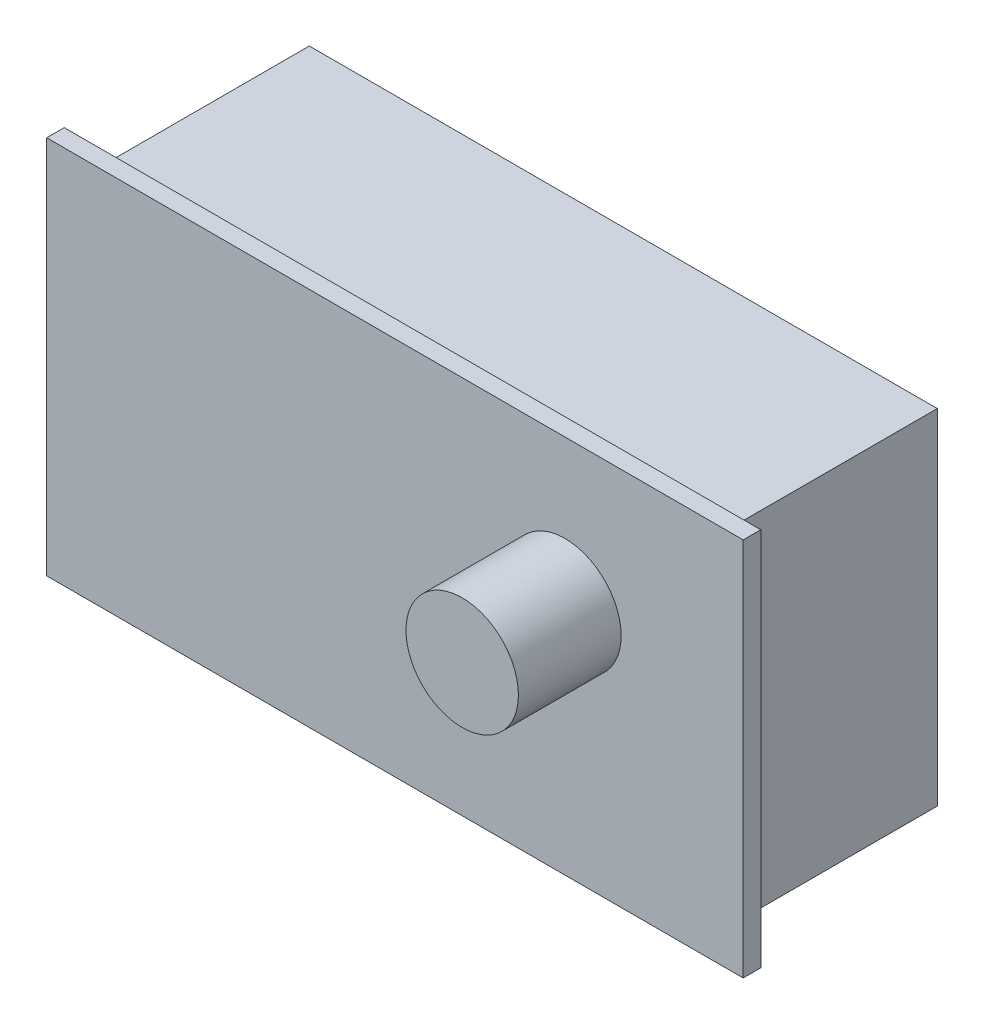
ISO-10303-21;
HEADER;
FILE_DESCRIPTION(('STEP AP214'),'2;1');
FILE_NAME('part.step','',(''),(''),'','','');
FILE_SCHEMA(('AUTOMOTIVE_DESIGN { 1 0 10303 214 1 1 1 1 }'));
ENDSEC;
DATA;
#1=APPLICATION_CONTEXT('core data for automotive mechanical design processes');
#2=APPLICATION_PROTOCOL_DEFINITION('international standard','automotive_design',2000,#1);
#3=PRODUCT_CONTEXT('',#1,'mechanical');
#4=PRODUCT('Part','Part','',(#3));
#5=PRODUCT_RELATED_PRODUCT_CATEGORY('part','',(#4));
#6=PRODUCT_DEFINITION_FORMATION('','',#4);
#7=PRODUCT_DEFINITION_CONTEXT('part definition',#1,'design');
#8=PRODUCT_DEFINITION('design','',#6,#7);
#9=PRODUCT_DEFINITION_SHAPE('','',#8);
#10=(LENGTH_UNIT() NAMED_UNIT(*) SI_UNIT(.MILLI.,.METRE.));
#11=(NAMED_UNIT(*) PLANE_ANGLE_UNIT() SI_UNIT($,.RADIAN.));
#12=(NAMED_UNIT(*) SI_UNIT($,.STERADIAN.) SOLID_ANGLE_UNIT());
#13=UNCERTAINTY_MEASURE_WITH_UNIT(LENGTH_MEASURE(1.E-05),#10,'distance_accuracy_value','');
#14=(GEOMETRIC_REPRESENTATION_CONTEXT(3) GLOBAL_UNCERTAINTY_ASSIGNED_CONTEXT((#13)) GLOBAL_UNIT_ASSIGNED_CONTEXT((#10,
#11,#12)) REPRESENTATION_CONTEXT('',''));
#15=CARTESIAN_POINT('',(0.,0.,0.));
#16=DIRECTION('',(0.,0.,1.));
#17=DIRECTION('',(1.,0.,0.));
#18=AXIS2_PLACEMENT_3D('',#15,#16,#17);
#19=CARTESIAN_POINT('',(0.,0.,24.));
#20=DIRECTION('',(1.,0.,0.));
#21=DIRECTION('',(0.,1.,0.));
#22=AXIS2_PLACEMENT_3D('',#19,#20,#21);
#23=PLANE('',#22);
#24=DIRECTION('',(0.,-1.,0.));
#25=VECTOR('',#24,1.);
#26=CARTESIAN_POINT('',(0.,0.,0.));
#27=LINE('',#26,#25);
#28=CARTESIAN_POINT('',(0.,0.,0.));
#29=VERTEX_POINT('',#28);
#30=CARTESIAN_POINT('',(0.,-39.2,0.));
#31=VERTEX_POINT('',#30);
#32=EDGE_CURVE('E131',#29,#31,#27,.T.);
#33=ORIENTED_EDGE('',*,*,#32,.T.);
#34=DIRECTION('',(0.,0.,-1.));
#35=VECTOR('',#34,1.);
#36=CARTESIAN_POINT('',(0.,-39.2,24.));
#37=LINE('',#36,#35);
#38=CARTESIAN_POINT('',(0.,-39.2,24.));
#39=VERTEX_POINT('',#38);
#40=EDGE_CURVE('E11',#39,#31,#37,.T.);
#41=ORIENTED_EDGE('',*,*,#40,.F.);
#42=DIRECTION('',(0.,-1.,0.));
#43=VECTOR('',#42,1.);
#44=CARTESIAN_POINT('',(0.,0.,24.));
#45=LINE('',#44,#43);
#46=CARTESIAN_POINT('',(0.,0.,24.));
#47=VERTEX_POINT('',#46);
#48=EDGE_CURVE('E140',#47,#39,#45,.T.);
#49=ORIENTED_EDGE('',*,*,#48,.F.);
#50=DIRECTION('',(0.,0.,-1.));
#51=VECTOR('',#50,1.);
#52=CARTESIAN_POINT('',(0.,0.,24.));
#53=LINE('',#52,#51);
#54=EDGE_CURVE('E149',#47,#29,#53,.T.);
#55=ORIENTED_EDGE('',*,*,#54,.T.);
#56=EDGE_LOOP('',(#33,#41,#49,#55));
#57=FACE_BOUND('',#56,.T.);
#58=ADVANCED_FACE('F33',(#57),#23,.F.);
#59=CARTESIAN_POINT('',(0.,-39.2,24.));
#60=DIRECTION('',(0.,1.,0.));
#61=DIRECTION('',(0.,0.,1.));
#62=AXIS2_PLACEMENT_3D('',#59,#60,#61);
#63=PLANE('',#62);
#64=DIRECTION('',(1.,0.,0.));
#65=VECTOR('',#64,1.);
#66=CARTESIAN_POINT('',(0.,-39.2,0.));
#67=LINE('',#66,#65);
#68=CARTESIAN_POINT('',(71.5,-39.2,0.));
#69=VERTEX_POINT('',#68);
#70=EDGE_CURVE('E134',#31,#69,#67,.T.);
#71=ORIENTED_EDGE('',*,*,#70,.T.);
#72=DIRECTION('',(0.,0.,-1.));
#73=VECTOR('',#72,1.);
#74=CARTESIAN_POINT('',(71.5,-39.2,24.));
#75=LINE('',#74,#73);
#76=CARTESIAN_POINT('',(71.5,-39.2,24.));
#77=VERTEX_POINT('',#76);
#78=EDGE_CURVE('E41',#77,#69,#75,.T.);
#79=ORIENTED_EDGE('',*,*,#78,.F.);
#80=DIRECTION('',(1.,0.,0.));
#81=VECTOR('',#80,1.);
#82=CARTESIAN_POINT('',(0.,-39.2,24.));
#83=LINE('',#82,#81);
#84=EDGE_CURVE('E75',#39,#77,#83,.T.);
#85=ORIENTED_EDGE('',*,*,#84,.F.);
#86=ORIENTED_EDGE('',*,*,#40,.T.);
#87=EDGE_LOOP('',(#71,#79,#85,#86));
#88=FACE_BOUND('',#87,.T.);
#89=ADVANCED_FACE('F175',(#88),#63,.F.);
#90=CARTESIAN_POINT('',(71.5,0.,24.));
#91=DIRECTION('',(-1.,0.,0.));
#92=DIRECTION('',(0.,0.,1.));
#93=AXIS2_PLACEMENT_3D('',#90,#91,#92);
#94=PLANE('',#93);
#95=DIRECTION('',(0.,1.,0.));
#96=VECTOR('',#95,1.);
#97=CARTESIAN_POINT('',(71.5,0.,0.));
#98=LINE('',#97,#96);
#99=CARTESIAN_POINT('',(71.5,0.,0.));
#100=VERTEX_POINT('',#99);
#101=EDGE_CURVE('E65',#69,#100,#98,.T.);
#102=ORIENTED_EDGE('',*,*,#101,.T.);
#103=DIRECTION('',(0.,0.,-1.));
#104=VECTOR('',#103,1.);
#105=CARTESIAN_POINT('',(71.5,0.,24.));
#106=LINE('',#105,#104);
#107=CARTESIAN_POINT('',(71.5,0.,24.));
#108=VERTEX_POINT('',#107);
#109=EDGE_CURVE('E49',#108,#100,#106,.T.);
#110=ORIENTED_EDGE('',*,*,#109,.F.);
#111=DIRECTION('',(0.,1.,0.));
#112=VECTOR('',#111,1.);
#113=CARTESIAN_POINT('',(71.5,0.,24.));
#114=LINE('',#113,#112);
#115=EDGE_CURVE('E144',#77,#108,#114,.T.);
#116=ORIENTED_EDGE('',*,*,#115,.F.);
#117=ORIENTED_EDGE('',*,*,#78,.T.);
#118=EDGE_LOOP('',(#102,#110,#116,#117));
#119=FACE_BOUND('',#118,.T.);
#120=ADVANCED_FACE('F155',(#119),#94,.F.);
#121=CARTESIAN_POINT('',(0.,0.,24.));
#122=DIRECTION('',(0.,-1.,0.));
#123=DIRECTION('',(0.,0.,-1.));
#124=AXIS2_PLACEMENT_3D('',#121,#122,#123);
#125=PLANE('',#124);
#126=DIRECTION('',(-1.,0.,0.));
#127=VECTOR('',#126,1.);
#128=CARTESIAN_POINT('',(0.,0.,0.));
#129=LINE('',#128,#127);
#130=EDGE_CURVE('E70',#100,#29,#129,.T.);
#131=ORIENTED_EDGE('',*,*,#130,.T.);
#132=ORIENTED_EDGE('',*,*,#54,.F.);
#133=DIRECTION('',(-1.,0.,0.));
#134=VECTOR('',#133,1.);
#135=CARTESIAN_POINT('',(0.,0.,24.));
#136=LINE('',#135,#134);
#137=EDGE_CURVE('E147',#108,#47,#136,.T.);
#138=ORIENTED_EDGE('',*,*,#137,.F.);
#139=ORIENTED_EDGE('',*,*,#109,.T.);
#140=EDGE_LOOP('',(#131,#132,#138,#139));
#141=FACE_BOUND('',#140,.T.);
#142=ADVANCED_FACE('F160',(#141),#125,.F.);
#143=CARTESIAN_POINT('',(0.,0.,0.));
#144=DIRECTION('',(0.,0.,1.));
#145=DIRECTION('',(1.,0.,0.));
#146=AXIS2_PLACEMENT_3D('',#143,#144,#145);
#147=PLANE('',#146);
#148=ORIENTED_EDGE('',*,*,#32,.F.);
#149=ORIENTED_EDGE('',*,*,#130,.F.);
#150=ORIENTED_EDGE('',*,*,#101,.F.);
#151=ORIENTED_EDGE('',*,*,#70,.F.);
#152=EDGE_LOOP('',(#148,#149,#150,#151));
#153=FACE_BOUND('',#152,.T.);
#154=ADVANCED_FACE('F158',(#153),#147,.F.);
#155=CARTESIAN_POINT('',(0.,0.,24.));
#156=DIRECTION('',(0.,0.,1.));
#157=DIRECTION('',(1.,0.,0.));
#158=AXIS2_PLACEMENT_3D('',#155,#156,#157);
#159=PLANE('',#158);
#160=DIRECTION('',(0.,-1.,0.));
#161=VECTOR('',#160,1.);
#162=CARTESIAN_POINT('',(-3.9,2.,24.));
#163=LINE('',#162,#161);
#164=CARTESIAN_POINT('',(-3.9,2.,24.));
#165=VERTEX_POINT('',#164);
#166=CARTESIAN_POINT('',(-3.89999999999999,-41.2,24.));
#167=VERTEX_POINT('',#166);
#168=EDGE_CURVE('E130',#165,#167,#163,.T.);
#169=ORIENTED_EDGE('',*,*,#168,.F.);
#170=DIRECTION('',(-1.,0.,0.));
#171=VECTOR('',#170,1.);
#172=CARTESIAN_POINT('',(-3.9,2.,24.));
#173=LINE('',#172,#171);
#174=CARTESIAN_POINT('',(75.4,2.,24.));
#175=VERTEX_POINT('',#174);
#176=EDGE_CURVE('E126',#175,#165,#173,.T.);
#177=ORIENTED_EDGE('',*,*,#176,.F.);
#178=DIRECTION('',(0.,1.,0.));
#179=VECTOR('',#178,1.);
#180=CARTESIAN_POINT('',(75.4,2.,24.));
#181=LINE('',#180,#179);
#182=CARTESIAN_POINT('',(75.4,-41.2,24.));
#183=VERTEX_POINT('',#182);
#184=EDGE_CURVE('E204',#183,#175,#181,.T.);
#185=ORIENTED_EDGE('',*,*,#184,.F.);
#186=DIRECTION('',(1.,0.,0.));
#187=VECTOR('',#186,1.);
#188=CARTESIAN_POINT('',(-3.89999999999999,-41.2,24.));
#189=LINE('',#188,#187);
#190=EDGE_CURVE('E207',#167,#183,#189,.T.);
#191=ORIENTED_EDGE('',*,*,#190,.F.);
#192=EDGE_LOOP('',(#169,#177,#185,#191));
#193=FACE_BOUND('',#192,.T.);
#194=ORIENTED_EDGE('',*,*,#137,.T.);
#195=ORIENTED_EDGE('',*,*,#48,.T.);
#196=ORIENTED_EDGE('',*,*,#84,.T.);
#197=ORIENTED_EDGE('',*,*,#115,.T.);
#198=EDGE_LOOP('',(#194,#195,#196,#197));
#199=FACE_BOUND('',#198,.T.);
#200=ADVANCED_FACE('F162',(#193,#199),#159,.F.);
#201=CARTESIAN_POINT('',(-3.9,2.,26.));
#202=DIRECTION('',(1.,0.,0.));
#203=DIRECTION('',(0.,1.,0.));
#204=AXIS2_PLACEMENT_3D('',#201,#202,#203);
#205=PLANE('',#204);
#206=ORIENTED_EDGE('',*,*,#168,.T.);
#207=DIRECTION('',(0.,0.,-1.));
#208=VECTOR('',#207,1.);
#209=CARTESIAN_POINT('',(-3.89999999999999,-41.2,26.));
#210=LINE('',#209,#208);
#211=CARTESIAN_POINT('',(-3.89999999999999,-41.2,26.));
#212=VERTEX_POINT('',#211);
#213=EDGE_CURVE('E110',#212,#167,#210,.T.);
#214=ORIENTED_EDGE('',*,*,#213,.F.);
#215=DIRECTION('',(0.,-1.,0.));
#216=VECTOR('',#215,1.);
#217=CARTESIAN_POINT('',(-3.9,2.,26.));
#218=LINE('',#217,#216);
#219=CARTESIAN_POINT('',(-3.9,2.,26.));
#220=VERTEX_POINT('',#219);
#221=EDGE_CURVE('E117',#220,#212,#218,.T.);
#222=ORIENTED_EDGE('',*,*,#221,.F.);
#223=DIRECTION('',(0.,0.,-1.));
#224=VECTOR('',#223,1.);
#225=CARTESIAN_POINT('',(-3.9,2.,26.));
#226=LINE('',#225,#224);
#227=EDGE_CURVE('E201',#220,#165,#226,.T.);
#228=ORIENTED_EDGE('',*,*,#227,.T.);
#229=EDGE_LOOP('',(#206,#214,#222,#228));
#230=FACE_BOUND('',#229,.T.);
#231=ADVANCED_FACE('F128',(#230),#205,.F.);
#232=CARTESIAN_POINT('',(-3.89999999999999,-41.2,26.));
#233=DIRECTION('',(0.,1.,0.));
#234=DIRECTION('',(0.,0.,1.));
#235=AXIS2_PLACEMENT_3D('',#232,#233,#234);
#236=PLANE('',#235);
#237=ORIENTED_EDGE('',*,*,#190,.T.);
#238=DIRECTION('',(0.,0.,-1.));
#239=VECTOR('',#238,1.);
#240=CARTESIAN_POINT('',(75.4,-41.2,26.));
#241=LINE('',#240,#239);
#242=CARTESIAN_POINT('',(75.4,-41.2,26.));
#243=VERTEX_POINT('',#242);
#244=EDGE_CURVE('E113',#243,#183,#241,.T.);
#245=ORIENTED_EDGE('',*,*,#244,.F.);
#246=DIRECTION('',(1.,0.,0.));
#247=VECTOR('',#246,1.);
#248=CARTESIAN_POINT('',(-3.89999999999999,-41.2,26.));
#249=LINE('',#248,#247);
#250=EDGE_CURVE('E106',#212,#243,#249,.T.);
#251=ORIENTED_EDGE('',*,*,#250,.F.);
#252=ORIENTED_EDGE('',*,*,#213,.T.);
#253=EDGE_LOOP('',(#237,#245,#251,#252));
#254=FACE_BOUND('',#253,.T.);
#255=ADVANCED_FACE('F108',(#254),#236,.F.);
#256=CARTESIAN_POINT('',(75.4,2.,26.));
#257=DIRECTION('',(-1.,0.,0.));
#258=DIRECTION('',(0.,0.,1.));
#259=AXIS2_PLACEMENT_3D('',#256,#257,#258);
#260=PLANE('',#259);
#261=ORIENTED_EDGE('',*,*,#184,.T.);
#262=DIRECTION('',(0.,0.,-1.));
#263=VECTOR('',#262,1.);
#264=CARTESIAN_POINT('',(75.4,2.,26.));
#265=LINE('',#264,#263);
#266=CARTESIAN_POINT('',(75.4,2.,26.));
#267=VERTEX_POINT('',#266);
#268=EDGE_CURVE('E136',#267,#175,#265,.T.);
#269=ORIENTED_EDGE('',*,*,#268,.F.);
#270=DIRECTION('',(0.,1.,0.));
#271=VECTOR('',#270,1.);
#272=CARTESIAN_POINT('',(75.4,2.,26.));
#273=LINE('',#272,#271);
#274=EDGE_CURVE('E116',#243,#267,#273,.T.);
#275=ORIENTED_EDGE('',*,*,#274,.F.);
#276=ORIENTED_EDGE('',*,*,#244,.T.);
#277=EDGE_LOOP('',(#261,#269,#275,#276));
#278=FACE_BOUND('',#277,.T.);
#279=ADVANCED_FACE('F188',(#278),#260,.F.);
#280=CARTESIAN_POINT('',(-3.9,2.,26.));
#281=DIRECTION('',(0.,-1.,0.));
#282=DIRECTION('',(0.,0.,-1.));
#283=AXIS2_PLACEMENT_3D('',#280,#281,#282);
#284=PLANE('',#283);
#285=ORIENTED_EDGE('',*,*,#176,.T.);
#286=ORIENTED_EDGE('',*,*,#227,.F.);
#287=DIRECTION('',(-1.,0.,0.));
#288=VECTOR('',#287,1.);
#289=CARTESIAN_POINT('',(-3.9,2.,26.));
#290=LINE('',#289,#288);
#291=EDGE_CURVE('E122',#267,#220,#290,.T.);
#292=ORIENTED_EDGE('',*,*,#291,.F.);
#293=ORIENTED_EDGE('',*,*,#268,.T.);
#294=EDGE_LOOP('',(#285,#286,#292,#293));
#295=FACE_BOUND('',#294,.T.);
#296=ADVANCED_FACE('F190',(#295),#284,.F.);
#297=CARTESIAN_POINT('',(0.,0.,26.));
#298=DIRECTION('',(0.,0.,1.));
#299=DIRECTION('',(1.,0.,0.));
#300=AXIS2_PLACEMENT_3D('',#297,#298,#299);
#301=PLANE('',#300);
#302=CARTESIAN_POINT('',(55.1057087912819,-14.4,26.));
#303=DIRECTION('',(0.,0.,1.));
#304=DIRECTION('',(1.,0.,0.));
#305=AXIS2_PLACEMENT_3D('',#302,#303,#304);
#306=CIRCLE('',#305,6.4);
#307=CARTESIAN_POINT('',(61.5057087912819,-14.4,26.));
#308=VERTEX_POINT('',#307);
#309=EDGE_CURVE('E212',#308,#308,#306,.T.);
#310=ORIENTED_EDGE('',*,*,#309,.F.);
#311=EDGE_LOOP('',(#310));
#312=FACE_BOUND('',#311,.T.);
#313=ORIENTED_EDGE('',*,*,#221,.T.);
#314=ORIENTED_EDGE('',*,*,#250,.T.);
#315=ORIENTED_EDGE('',*,*,#274,.T.);
#316=ORIENTED_EDGE('',*,*,#291,.T.);
#317=EDGE_LOOP('',(#313,#314,#315,#316));
#318=FACE_BOUND('',#317,.T.);
#319=ADVANCED_FACE('F120',(#312,#318),#301,.T.);
#320=CARTESIAN_POINT('',(55.1057087912819,-14.4,37.7));
#321=DIRECTION('',(0.,0.,-1.));
#322=DIRECTION('',(-1.,0.,0.));
#323=AXIS2_PLACEMENT_3D('',#320,#321,#322);
#324=CYLINDRICAL_SURFACE('',#323,6.4);
#325=CARTESIAN_POINT('',(55.1057087912819,-14.4,37.7));
#326=DIRECTION('',(0.,0.,1.));
#327=DIRECTION('',(1.,0.,0.));
#328=AXIS2_PLACEMENT_3D('',#325,#326,#327);
#329=CIRCLE('',#328,6.4);
#330=CARTESIAN_POINT('',(61.5057087912819,-14.4,37.7));
#331=VERTEX_POINT('',#330);
#332=EDGE_CURVE('E208',#331,#331,#329,.T.);
#333=ORIENTED_EDGE('',*,*,#332,.F.);
#334=EDGE_LOOP('',(#333));
#335=FACE_BOUND('',#334,.T.);
#336=ORIENTED_EDGE('',*,*,#309,.T.);
#337=EDGE_LOOP('',(#336));
#338=FACE_BOUND('',#337,.T.);
#339=ADVANCED_FACE('F197',(#335,#338),#324,.T.);
#340=CARTESIAN_POINT('',(55.1057087912819,-14.4,37.7));
#341=DIRECTION('',(0.,0.,1.));
#342=DIRECTION('',(1.,0.,0.));
#343=AXIS2_PLACEMENT_3D('',#340,#341,#342);
#344=PLANE('',#343);
#345=ORIENTED_EDGE('',*,*,#332,.T.);
#346=EDGE_LOOP('',(#345));
#347=FACE_BOUND('',#346,.T.);
#348=ADVANCED_FACE('F222',(#347),#344,.T.);
#349=CLOSED_SHELL('',(#58,#89,#120,#142,#154,#200,#231,#255,#279,#296,#319,#339,#348));
#350=MANIFOLD_SOLID_BREP('B2',#349);
#351=ADVANCED_BREP_SHAPE_REPRESENTATION('',(#18,#350),#14);
#352=SHAPE_DEFINITION_REPRESENTATION(#9,#351);
ENDSEC;
END-ISO-10303-21;
